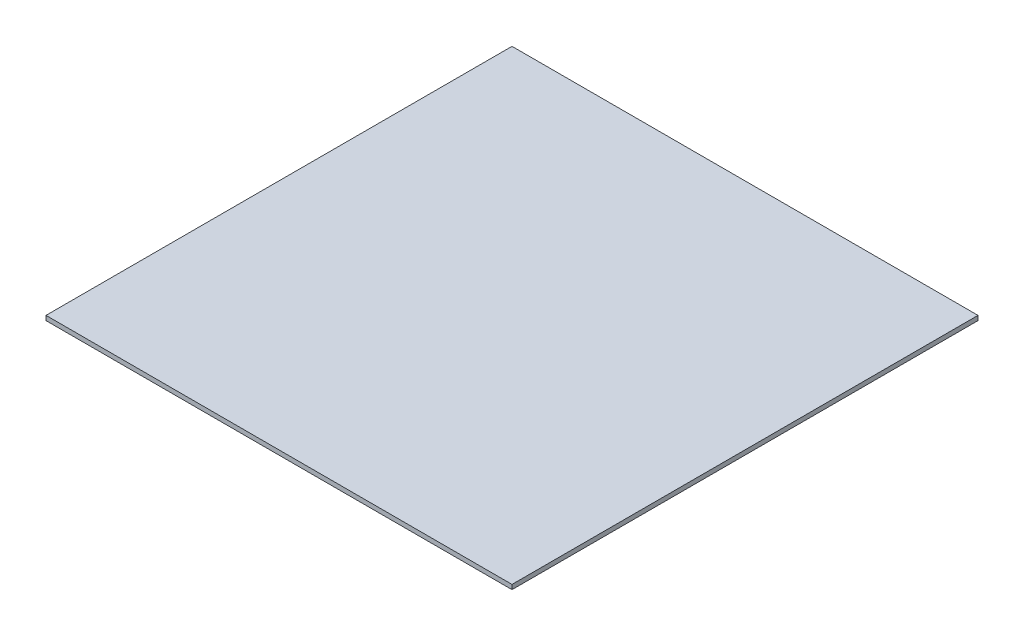
ISO-10303-21;
HEADER;
FILE_DESCRIPTION(('STEP AP214'),'2;1');
FILE_NAME('part.step','',(''),(''),'','','');
FILE_SCHEMA(('AUTOMOTIVE_DESIGN { 1 0 10303 214 1 1 1 1 }'));
ENDSEC;
DATA;
#1=APPLICATION_CONTEXT('core data for automotive mechanical design processes');
#2=APPLICATION_PROTOCOL_DEFINITION('international standard','automotive_design',2000,#1);
#3=PRODUCT_CONTEXT('',#1,'mechanical');
#4=PRODUCT('Part','Part','',(#3));
#5=PRODUCT_RELATED_PRODUCT_CATEGORY('part','',(#4));
#6=PRODUCT_DEFINITION_FORMATION('','',#4);
#7=PRODUCT_DEFINITION_CONTEXT('part definition',#1,'design');
#8=PRODUCT_DEFINITION('design','',#6,#7);
#9=PRODUCT_DEFINITION_SHAPE('','',#8);
#10=(LENGTH_UNIT() NAMED_UNIT(*) SI_UNIT(.MILLI.,.METRE.));
#11=(NAMED_UNIT(*) PLANE_ANGLE_UNIT() SI_UNIT($,.RADIAN.));
#12=(NAMED_UNIT(*) SI_UNIT($,.STERADIAN.) SOLID_ANGLE_UNIT());
#13=UNCERTAINTY_MEASURE_WITH_UNIT(LENGTH_MEASURE(1.E-05),#10,'distance_accuracy_value','');
#14=(GEOMETRIC_REPRESENTATION_CONTEXT(3) GLOBAL_UNCERTAINTY_ASSIGNED_CONTEXT((#13)) GLOBAL_UNIT_ASSIGNED_CONTEXT((#10,
#11,#12)) REPRESENTATION_CONTEXT('',''));
#15=CARTESIAN_POINT('',(0.,0.,0.));
#16=DIRECTION('',(0.,0.,1.));
#17=DIRECTION('',(1.,0.,0.));
#18=AXIS2_PLACEMENT_3D('',#15,#16,#17);
#19=CARTESIAN_POINT('',(647.7,12.7,647.7));
#20=DIRECTION('',(-1.,0.,0.));
#21=DIRECTION('',(0.,0.,1.));
#22=AXIS2_PLACEMENT_3D('',#19,#20,#21);
#23=PLANE('',#22);
#24=DIRECTION('',(0.,0.,-1.));
#25=VECTOR('',#24,1.);
#26=CARTESIAN_POINT('',(647.7,0.,647.7));
#27=LINE('',#26,#25);
#28=CARTESIAN_POINT('',(647.7,0.,647.7));
#29=VERTEX_POINT('',#28);
#30=CARTESIAN_POINT('',(647.7,0.,-647.7));
#31=VERTEX_POINT('',#30);
#32=EDGE_CURVE('E98',#29,#31,#27,.T.);
#33=ORIENTED_EDGE('',*,*,#32,.T.);
#34=DIRECTION('',(0.,-1.,0.));
#35=VECTOR('',#34,1.);
#36=CARTESIAN_POINT('',(647.7,12.7,-647.7));
#37=LINE('',#36,#35);
#38=CARTESIAN_POINT('',(647.7,12.7,-647.7));
#39=VERTEX_POINT('',#38);
#40=EDGE_CURVE('E11',#39,#31,#37,.T.);
#41=ORIENTED_EDGE('',*,*,#40,.F.);
#42=DIRECTION('',(0.,0.,-1.));
#43=VECTOR('',#42,1.);
#44=CARTESIAN_POINT('',(647.7,12.7,647.7));
#45=LINE('',#44,#43);
#46=CARTESIAN_POINT('',(647.7,12.7,647.7));
#47=VERTEX_POINT('',#46);
#48=EDGE_CURVE('E86',#47,#39,#45,.T.);
#49=ORIENTED_EDGE('',*,*,#48,.F.);
#50=DIRECTION('',(0.,-1.,0.));
#51=VECTOR('',#50,1.);
#52=CARTESIAN_POINT('',(647.7,12.7,647.7));
#53=LINE('',#52,#51);
#54=EDGE_CURVE('E94',#47,#29,#53,.T.);
#55=ORIENTED_EDGE('',*,*,#54,.T.);
#56=EDGE_LOOP('',(#33,#41,#49,#55));
#57=FACE_BOUND('',#56,.T.);
#58=ADVANCED_FACE('F35',(#57),#23,.F.);
#59=CARTESIAN_POINT('',(-647.7,12.7,-647.7));
#60=DIRECTION('',(0.,0.,1.));
#61=DIRECTION('',(1.,0.,0.));
#62=AXIS2_PLACEMENT_3D('',#59,#60,#61);
#63=PLANE('',#62);
#64=DIRECTION('',(-1.,0.,0.));
#65=VECTOR('',#64,1.);
#66=CARTESIAN_POINT('',(-647.7,0.,-647.7));
#67=LINE('',#66,#65);
#68=CARTESIAN_POINT('',(-647.7,0.,-647.7));
#69=VERTEX_POINT('',#68);
#70=EDGE_CURVE('E90',#31,#69,#67,.T.);
#71=ORIENTED_EDGE('',*,*,#70,.T.);
#72=DIRECTION('',(0.,-1.,0.));
#73=VECTOR('',#72,1.);
#74=CARTESIAN_POINT('',(-647.7,12.7,-647.7));
#75=LINE('',#74,#73);
#76=CARTESIAN_POINT('',(-647.7,12.7,-647.7));
#77=VERTEX_POINT('',#76);
#78=EDGE_CURVE('E43',#77,#69,#75,.T.);
#79=ORIENTED_EDGE('',*,*,#78,.F.);
#80=DIRECTION('',(-1.,0.,0.));
#81=VECTOR('',#80,1.);
#82=CARTESIAN_POINT('',(-647.7,12.7,-647.7));
#83=LINE('',#82,#81);
#84=EDGE_CURVE('E81',#39,#77,#83,.T.);
#85=ORIENTED_EDGE('',*,*,#84,.F.);
#86=ORIENTED_EDGE('',*,*,#40,.T.);
#87=EDGE_LOOP('',(#71,#79,#85,#86));
#88=FACE_BOUND('',#87,.T.);
#89=ADVANCED_FACE('F89',(#88),#63,.F.);
#90=CARTESIAN_POINT('',(-647.7,12.7,647.7));
#91=DIRECTION('',(1.,0.,0.));
#92=DIRECTION('',(0.,0.,-1.));
#93=AXIS2_PLACEMENT_3D('',#90,#91,#92);
#94=PLANE('',#93);
#95=DIRECTION('',(0.,0.,1.));
#96=VECTOR('',#95,1.);
#97=CARTESIAN_POINT('',(-647.7,0.,647.7));
#98=LINE('',#97,#96);
#99=CARTESIAN_POINT('',(-647.7,0.,647.7));
#100=VERTEX_POINT('',#99);
#101=EDGE_CURVE('E68',#69,#100,#98,.T.);
#102=ORIENTED_EDGE('',*,*,#101,.T.);
#103=DIRECTION('',(0.,-1.,0.));
#104=VECTOR('',#103,1.);
#105=CARTESIAN_POINT('',(-647.7,12.7,647.7));
#106=LINE('',#105,#104);
#107=CARTESIAN_POINT('',(-647.7,12.7,647.7));
#108=VERTEX_POINT('',#107);
#109=EDGE_CURVE('E91',#108,#100,#106,.T.);
#110=ORIENTED_EDGE('',*,*,#109,.F.);
#111=DIRECTION('',(0.,0.,1.));
#112=VECTOR('',#111,1.);
#113=CARTESIAN_POINT('',(-647.7,12.7,647.7));
#114=LINE('',#113,#112);
#115=EDGE_CURVE('E84',#77,#108,#114,.T.);
#116=ORIENTED_EDGE('',*,*,#115,.F.);
#117=ORIENTED_EDGE('',*,*,#78,.T.);
#118=EDGE_LOOP('',(#102,#110,#116,#117));
#119=FACE_BOUND('',#118,.T.);
#120=ADVANCED_FACE('F92',(#119),#94,.F.);
#121=CARTESIAN_POINT('',(-647.7,12.7,647.7));
#122=DIRECTION('',(0.,0.,-1.));
#123=DIRECTION('',(-1.,0.,0.));
#124=AXIS2_PLACEMENT_3D('',#121,#122,#123);
#125=PLANE('',#124);
#126=DIRECTION('',(1.,0.,0.));
#127=VECTOR('',#126,1.);
#128=CARTESIAN_POINT('',(-647.7,0.,647.7));
#129=LINE('',#128,#127);
#130=EDGE_CURVE('E74',#100,#29,#129,.T.);
#131=ORIENTED_EDGE('',*,*,#130,.T.);
#132=ORIENTED_EDGE('',*,*,#54,.F.);
#133=DIRECTION('',(1.,0.,0.));
#134=VECTOR('',#133,1.);
#135=CARTESIAN_POINT('',(-647.7,12.7,647.7));
#136=LINE('',#135,#134);
#137=EDGE_CURVE('E51',#108,#47,#136,.T.);
#138=ORIENTED_EDGE('',*,*,#137,.F.);
#139=ORIENTED_EDGE('',*,*,#109,.T.);
#140=EDGE_LOOP('',(#131,#132,#138,#139));
#141=FACE_BOUND('',#140,.T.);
#142=ADVANCED_FACE('F105',(#141),#125,.F.);
#143=CARTESIAN_POINT('',(0.,12.7,0.));
#144=DIRECTION('',(0.,-1.,0.));
#145=DIRECTION('',(0.,0.,-1.));
#146=AXIS2_PLACEMENT_3D('',#143,#144,#145);
#147=PLANE('',#146);
#148=ORIENTED_EDGE('',*,*,#48,.T.);
#149=ORIENTED_EDGE('',*,*,#84,.T.);
#150=ORIENTED_EDGE('',*,*,#115,.T.);
#151=ORIENTED_EDGE('',*,*,#137,.T.);
#152=EDGE_LOOP('',(#148,#149,#150,#151));
#153=FACE_BOUND('',#152,.T.);
#154=ADVANCED_FACE('F82',(#153),#147,.F.);
#155=CARTESIAN_POINT('',(0.,0.,0.));
#156=DIRECTION('',(0.,-1.,0.));
#157=DIRECTION('',(0.,0.,-1.));
#158=AXIS2_PLACEMENT_3D('',#155,#156,#157);
#159=PLANE('',#158);
#160=ORIENTED_EDGE('',*,*,#32,.F.);
#161=ORIENTED_EDGE('',*,*,#130,.F.);
#162=ORIENTED_EDGE('',*,*,#101,.F.);
#163=ORIENTED_EDGE('',*,*,#70,.F.);
#164=EDGE_LOOP('',(#160,#161,#162,#163));
#165=FACE_BOUND('',#164,.T.);
#166=ADVANCED_FACE('F108',(#165),#159,.T.);
#167=CLOSED_SHELL('',(#58,#89,#120,#142,#154,#166));
#168=MANIFOLD_SOLID_BREP('B2',#167);
#169=ADVANCED_BREP_SHAPE_REPRESENTATION('',(#18,#168),#14);
#170=SHAPE_DEFINITION_REPRESENTATION(#9,#169);
ENDSEC;
END-ISO-10303-21;
